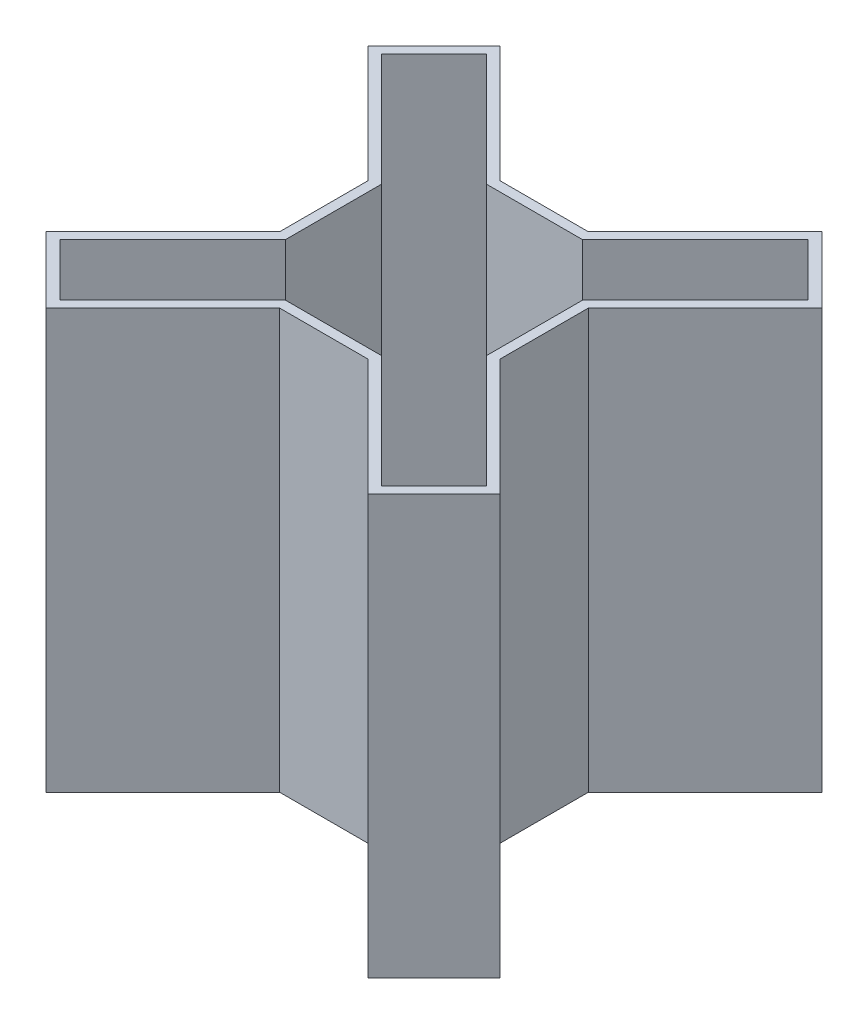
ISO-10303-21;
HEADER;
FILE_DESCRIPTION(('STEP AP214'),'2;1');
FILE_NAME('part.step','',(''),(''),'','','');
FILE_SCHEMA(('AUTOMOTIVE_DESIGN { 1 0 10303 214 1 1 1 1 }'));
ENDSEC;
DATA;
#1=APPLICATION_CONTEXT('core data for automotive mechanical design processes');
#2=APPLICATION_PROTOCOL_DEFINITION('international standard','automotive_design',2000,#1);
#3=PRODUCT_CONTEXT('',#1,'mechanical');
#4=PRODUCT('Part','Part','',(#3));
#5=PRODUCT_RELATED_PRODUCT_CATEGORY('part','',(#4));
#6=PRODUCT_DEFINITION_FORMATION('','',#4);
#7=PRODUCT_DEFINITION_CONTEXT('part definition',#1,'design');
#8=PRODUCT_DEFINITION('design','',#6,#7);
#9=PRODUCT_DEFINITION_SHAPE('','',#8);
#10=(LENGTH_UNIT() NAMED_UNIT(*) SI_UNIT(.MILLI.,.METRE.));
#11=(NAMED_UNIT(*) PLANE_ANGLE_UNIT() SI_UNIT($,.RADIAN.));
#12=(NAMED_UNIT(*) SI_UNIT($,.STERADIAN.) SOLID_ANGLE_UNIT());
#13=UNCERTAINTY_MEASURE_WITH_UNIT(LENGTH_MEASURE(1.E-05),#10,'distance_accuracy_value','');
#14=(GEOMETRIC_REPRESENTATION_CONTEXT(3) GLOBAL_UNCERTAINTY_ASSIGNED_CONTEXT((#13)) GLOBAL_UNIT_ASSIGNED_CONTEXT((#10,
#11,#12)) REPRESENTATION_CONTEXT('',''));
#15=CARTESIAN_POINT('',(0.,0.,0.));
#16=DIRECTION('',(0.,0.,1.));
#17=DIRECTION('',(1.,0.,0.));
#18=AXIS2_PLACEMENT_3D('',#15,#16,#17);
#19=CARTESIAN_POINT('',(-113.787540309447,-420.,44.4220917886808));
#20=DIRECTION('',(-1.,0.,0.));
#21=DIRECTION('',(0.,0.,1.));
#22=AXIS2_PLACEMENT_3D('',#19,#20,#21);
#23=PLANE('',#22);
#24=DIRECTION('',(0.,0.,1.));
#25=VECTOR('',#24,1.);
#26=CARTESIAN_POINT('',(-113.787540309447,0.,44.4220917886808));
#27=LINE('',#26,#25);
#28=CARTESIAN_POINT('',(-113.787540309447,0.,-45.9052893155388));
#29=VERTEX_POINT('',#28);
#30=CARTESIAN_POINT('',(-113.787540309447,0.,44.4220917886808));
#31=VERTEX_POINT('',#30);
#32=EDGE_CURVE('E462',#29,#31,#27,.T.);
#33=ORIENTED_EDGE('',*,*,#32,.F.);
#34=DIRECTION('',(0.,1.,0.));
#35=VECTOR('',#34,1.);
#36=CARTESIAN_POINT('',(-113.787540309447,-420.,-45.9052893155388));
#37=LINE('',#36,#35);
#38=CARTESIAN_POINT('',(-113.787540309447,-430.,-45.9052893155388));
#39=VERTEX_POINT('',#38);
#40=EDGE_CURVE('E11',#39,#29,#37,.T.);
#41=ORIENTED_EDGE('',*,*,#40,.F.);
#42=DIRECTION('',(0.,0.,-1.));
#43=VECTOR('',#42,1.);
#44=CARTESIAN_POINT('',(-113.787540309447,-430.,44.4220917886808));
#45=LINE('',#44,#43);
#46=CARTESIAN_POINT('',(-113.787540309447,-430.,44.4220917886808));
#47=VERTEX_POINT('',#46);
#48=EDGE_CURVE('E267',#47,#39,#45,.T.);
#49=ORIENTED_EDGE('',*,*,#48,.F.);
#50=DIRECTION('',(0.,1.,0.));
#51=VECTOR('',#50,1.);
#52=CARTESIAN_POINT('',(-113.787540309447,-420.,44.4220917886808));
#53=LINE('',#52,#51);
#54=EDGE_CURVE('E48',#47,#31,#53,.T.);
#55=ORIENTED_EDGE('',*,*,#54,.T.);
#56=EDGE_LOOP('',(#33,#41,#49,#55));
#57=FACE_BOUND('',#56,.T.);
#58=ADVANCED_FACE('F45',(#57),#23,.T.);
#59=CARTESIAN_POINT('',(-113.787540309447,-420.,-45.9052893155388));
#60=DIRECTION('',(-0.707106781186547,0.,0.707106781186548));
#61=DIRECTION('',(0.707106781186548,0.,0.707106781186547));
#62=AXIS2_PLACEMENT_3D('',#59,#60,#61);
#63=PLANE('',#62);
#64=DIRECTION('',(0.707106781186548,0.,0.707106781186547));
#65=VECTOR('',#64,1.);
#66=CARTESIAN_POINT('',(-113.787540309447,0.,-45.9052893155388));
#67=LINE('',#66,#65);
#68=CARTESIAN_POINT('',(-233.518909135593,0.,-165.636658141684));
#69=VERTEX_POINT('',#68);
#70=EDGE_CURVE('E265',#69,#29,#67,.T.);
#71=ORIENTED_EDGE('',*,*,#70,.F.);
#72=DIRECTION('',(0.,1.,0.));
#73=VECTOR('',#72,1.);
#74=CARTESIAN_POINT('',(-233.518909135593,-420.,-165.636658141684));
#75=LINE('',#74,#73);
#76=CARTESIAN_POINT('',(-233.518909135593,-430.,-165.636658141684));
#77=VERTEX_POINT('',#76);
#78=EDGE_CURVE('E54',#77,#69,#75,.T.);
#79=ORIENTED_EDGE('',*,*,#78,.F.);
#80=DIRECTION('',(-0.707106781186548,0.,-0.707106781186547));
#81=VECTOR('',#80,1.);
#82=CARTESIAN_POINT('',(-113.787540309447,-430.,-45.9052893155388));
#83=LINE('',#82,#81);
#84=EDGE_CURVE('E271',#39,#77,#83,.T.);
#85=ORIENTED_EDGE('',*,*,#84,.F.);
#86=ORIENTED_EDGE('',*,*,#40,.T.);
#87=EDGE_LOOP('',(#71,#79,#85,#86));
#88=FACE_BOUND('',#87,.T.);
#89=ADVANCED_FACE('F611',(#88),#63,.T.);
#90=CARTESIAN_POINT('',(-233.518909135593,-420.,-165.636658141684));
#91=DIRECTION('',(-0.707106781186548,0.,-0.707106781186548));
#92=DIRECTION('',(-0.707106781186548,0.,0.707106781186548));
#93=AXIS2_PLACEMENT_3D('',#90,#91,#92);
#94=PLANE('',#93);
#95=DIRECTION('',(-0.707106781186547,0.,0.707106781186547));
#96=VECTOR('',#95,1.);
#97=CARTESIAN_POINT('',(-233.518909135593,0.,-165.636658141684));
#98=LINE('',#97,#96);
#99=CARTESIAN_POINT('',(-165.636658141684,0.,-233.518909135593));
#100=VERTEX_POINT('',#99);
#101=EDGE_CURVE('E559',#100,#69,#98,.T.);
#102=ORIENTED_EDGE('',*,*,#101,.F.);
#103=DIRECTION('',(0.,1.,0.));
#104=VECTOR('',#103,1.);
#105=CARTESIAN_POINT('',(-165.636658141684,-420.,-233.518909135593));
#106=LINE('',#105,#104);
#107=CARTESIAN_POINT('',(-165.636658141684,-430.,-233.518909135593));
#108=VERTEX_POINT('',#107);
#109=EDGE_CURVE('E568',#108,#100,#106,.T.);
#110=ORIENTED_EDGE('',*,*,#109,.F.);
#111=DIRECTION('',(0.707106781186547,0.,-0.707106781186547));
#112=VECTOR('',#111,1.);
#113=CARTESIAN_POINT('',(-233.518909135593,-430.,-165.636658141684));
#114=LINE('',#113,#112);
#115=EDGE_CURVE('E283',#77,#108,#114,.T.);
#116=ORIENTED_EDGE('',*,*,#115,.F.);
#117=ORIENTED_EDGE('',*,*,#78,.T.);
#118=EDGE_LOOP('',(#102,#110,#116,#117));
#119=FACE_BOUND('',#118,.T.);
#120=ADVANCED_FACE('F615',(#119),#94,.T.);
#121=CARTESIAN_POINT('',(-45.9052893155389,-420.,-113.787540309447));
#122=DIRECTION('',(0.707106781186548,0.,-0.707106781186547));
#123=DIRECTION('',(-0.707106781186547,0.,-0.707106781186548));
#124=AXIS2_PLACEMENT_3D('',#121,#122,#123);
#125=PLANE('',#124);
#126=DIRECTION('',(-0.707106781186547,0.,-0.707106781186548));
#127=VECTOR('',#126,1.);
#128=CARTESIAN_POINT('',(-45.9052893155389,0.,-113.787540309447));
#129=LINE('',#128,#127);
#130=CARTESIAN_POINT('',(-45.9052893155389,0.,-113.787540309447));
#131=VERTEX_POINT('',#130);
#132=EDGE_CURVE('E555',#131,#100,#129,.T.);
#133=ORIENTED_EDGE('',*,*,#132,.F.);
#134=DIRECTION('',(0.,1.,0.));
#135=VECTOR('',#134,1.);
#136=CARTESIAN_POINT('',(-45.9052893155389,-420.,-113.787540309447));
#137=LINE('',#136,#135);
#138=CARTESIAN_POINT('',(-45.9052893155389,-430.,-113.787540309447));
#139=VERTEX_POINT('',#138);
#140=EDGE_CURVE('E571',#139,#131,#137,.T.);
#141=ORIENTED_EDGE('',*,*,#140,.F.);
#142=DIRECTION('',(0.707106781186547,0.,0.707106781186548));
#143=VECTOR('',#142,1.);
#144=CARTESIAN_POINT('',(-165.636658141684,-430.,-233.518909135593));
#145=LINE('',#144,#143);
#146=EDGE_CURVE('E287',#108,#139,#145,.T.);
#147=ORIENTED_EDGE('',*,*,#146,.F.);
#148=ORIENTED_EDGE('',*,*,#109,.T.);
#149=EDGE_LOOP('',(#133,#141,#147,#148));
#150=FACE_BOUND('',#149,.T.);
#151=ADVANCED_FACE('F618',(#150),#125,.T.);
#152=CARTESIAN_POINT('',(-45.9052893155389,-420.,-113.787540309447));
#153=DIRECTION('',(0.,0.,-1.));
#154=DIRECTION('',(-1.,0.,0.));
#155=AXIS2_PLACEMENT_3D('',#152,#153,#154);
#156=PLANE('',#155);
#157=DIRECTION('',(-1.,0.,0.));
#158=VECTOR('',#157,1.);
#159=CARTESIAN_POINT('',(-45.9052893155389,0.,-113.787540309447));
#160=LINE('',#159,#158);
#161=CARTESIAN_POINT('',(44.4220917886808,0.,-113.787540309447));
#162=VERTEX_POINT('',#161);
#163=EDGE_CURVE('E551',#162,#131,#160,.T.);
#164=ORIENTED_EDGE('',*,*,#163,.F.);
#165=DIRECTION('',(0.,1.,0.));
#166=VECTOR('',#165,1.);
#167=CARTESIAN_POINT('',(44.4220917886808,-420.,-113.787540309447));
#168=LINE('',#167,#166);
#169=CARTESIAN_POINT('',(44.4220917886808,-430.,-113.787540309447));
#170=VERTEX_POINT('',#169);
#171=EDGE_CURVE('E574',#170,#162,#168,.T.);
#172=ORIENTED_EDGE('',*,*,#171,.F.);
#173=DIRECTION('',(1.,0.,0.));
#174=VECTOR('',#173,1.);
#175=CARTESIAN_POINT('',(-45.9052893155389,-430.,-113.787540309447));
#176=LINE('',#175,#174);
#177=EDGE_CURVE('E291',#139,#170,#176,.T.);
#178=ORIENTED_EDGE('',*,*,#177,.F.);
#179=ORIENTED_EDGE('',*,*,#140,.T.);
#180=EDGE_LOOP('',(#164,#172,#178,#179));
#181=FACE_BOUND('',#180,.T.);
#182=ADVANCED_FACE('F623',(#181),#156,.T.);
#183=CARTESIAN_POINT('',(44.4220917886808,-420.,-113.787540309447));
#184=DIRECTION('',(-0.707106781186547,0.,-0.707106781186548));
#185=DIRECTION('',(-0.707106781186548,0.,0.707106781186547));
#186=AXIS2_PLACEMENT_3D('',#183,#184,#185);
#187=PLANE('',#186);
#188=DIRECTION('',(-0.707106781186548,0.,0.707106781186547));
#189=VECTOR('',#188,1.);
#190=CARTESIAN_POINT('',(44.4220917886808,0.,-113.787540309447));
#191=LINE('',#190,#189);
#192=CARTESIAN_POINT('',(164.153460614826,0.,-233.518909135592));
#193=VERTEX_POINT('',#192);
#194=EDGE_CURVE('E547',#193,#162,#191,.T.);
#195=ORIENTED_EDGE('',*,*,#194,.F.);
#196=DIRECTION('',(0.,1.,0.));
#197=VECTOR('',#196,1.);
#198=CARTESIAN_POINT('',(164.153460614826,-420.,-233.518909135592));
#199=LINE('',#198,#197);
#200=CARTESIAN_POINT('',(164.153460614826,-430.,-233.518909135592));
#201=VERTEX_POINT('',#200);
#202=EDGE_CURVE('E577',#201,#193,#199,.T.);
#203=ORIENTED_EDGE('',*,*,#202,.F.);
#204=DIRECTION('',(0.707106781186548,0.,-0.707106781186547));
#205=VECTOR('',#204,1.);
#206=CARTESIAN_POINT('',(44.4220917886808,-430.,-113.787540309447));
#207=LINE('',#206,#205);
#208=EDGE_CURVE('E295',#170,#201,#207,.T.);
#209=ORIENTED_EDGE('',*,*,#208,.F.);
#210=ORIENTED_EDGE('',*,*,#171,.T.);
#211=EDGE_LOOP('',(#195,#203,#209,#210));
#212=FACE_BOUND('',#211,.T.);
#213=ADVANCED_FACE('F626',(#212),#187,.T.);
#214=CARTESIAN_POINT('',(164.153460614826,-420.,-233.518909135592));
#215=DIRECTION('',(0.707106781186548,0.,-0.707106781186548));
#216=DIRECTION('',(-0.707106781186548,0.,-0.707106781186548));
#217=AXIS2_PLACEMENT_3D('',#214,#215,#216);
#218=PLANE('',#217);
#219=DIRECTION('',(-0.707106781186548,0.,-0.707106781186548));
#220=VECTOR('',#219,1.);
#221=CARTESIAN_POINT('',(164.153460614826,0.,-233.518909135592));
#222=LINE('',#221,#220);
#223=CARTESIAN_POINT('',(232.035711608734,0.,-165.636658141684));
#224=VERTEX_POINT('',#223);
#225=EDGE_CURVE('E543',#224,#193,#222,.T.);
#226=ORIENTED_EDGE('',*,*,#225,.F.);
#227=DIRECTION('',(0.,1.,0.));
#228=VECTOR('',#227,1.);
#229=CARTESIAN_POINT('',(232.035711608734,-420.,-165.636658141684));
#230=LINE('',#229,#228);
#231=CARTESIAN_POINT('',(232.035711608734,-430.,-165.636658141684));
#232=VERTEX_POINT('',#231);
#233=EDGE_CURVE('E580',#232,#224,#230,.T.);
#234=ORIENTED_EDGE('',*,*,#233,.F.);
#235=DIRECTION('',(0.707106781186548,0.,0.707106781186548));
#236=VECTOR('',#235,1.);
#237=CARTESIAN_POINT('',(164.153460614826,-430.,-233.518909135592));
#238=LINE('',#237,#236);
#239=EDGE_CURVE('E299',#201,#232,#238,.T.);
#240=ORIENTED_EDGE('',*,*,#239,.F.);
#241=ORIENTED_EDGE('',*,*,#202,.T.);
#242=EDGE_LOOP('',(#226,#234,#240,#241));
#243=FACE_BOUND('',#242,.T.);
#244=ADVANCED_FACE('F631',(#243),#218,.T.);
#245=CARTESIAN_POINT('',(112.304342782589,-420.,-45.9052893155389));
#246=DIRECTION('',(0.707106781186548,0.,0.707106781186548));
#247=DIRECTION('',(0.707106781186548,0.,-0.707106781186548));
#248=AXIS2_PLACEMENT_3D('',#245,#246,#247);
#249=PLANE('',#248);
#250=DIRECTION('',(0.707106781186548,0.,-0.707106781186548));
#251=VECTOR('',#250,1.);
#252=CARTESIAN_POINT('',(112.304342782589,0.,-45.9052893155389));
#253=LINE('',#252,#251);
#254=CARTESIAN_POINT('',(112.304342782589,0.,-45.9052893155389));
#255=VERTEX_POINT('',#254);
#256=EDGE_CURVE('E539',#255,#224,#253,.T.);
#257=ORIENTED_EDGE('',*,*,#256,.F.);
#258=DIRECTION('',(0.,1.,0.));
#259=VECTOR('',#258,1.);
#260=CARTESIAN_POINT('',(112.304342782589,-420.,-45.9052893155389));
#261=LINE('',#260,#259);
#262=CARTESIAN_POINT('',(112.304342782589,-430.,-45.9052893155389));
#263=VERTEX_POINT('',#262);
#264=EDGE_CURVE('E583',#263,#255,#261,.T.);
#265=ORIENTED_EDGE('',*,*,#264,.F.);
#266=DIRECTION('',(-0.707106781186548,0.,0.707106781186548));
#267=VECTOR('',#266,1.);
#268=CARTESIAN_POINT('',(232.035711608734,-430.,-165.636658141684));
#269=LINE('',#268,#267);
#270=EDGE_CURVE('E303',#232,#263,#269,.T.);
#271=ORIENTED_EDGE('',*,*,#270,.F.);
#272=ORIENTED_EDGE('',*,*,#233,.T.);
#273=EDGE_LOOP('',(#257,#265,#271,#272));
#274=FACE_BOUND('',#273,.T.);
#275=ADVANCED_FACE('F634',(#274),#249,.T.);
#276=CARTESIAN_POINT('',(112.304342782589,-420.,44.4220917886809));
#277=DIRECTION('',(1.,0.,0.));
#278=DIRECTION('',(0.,0.,-1.));
#279=AXIS2_PLACEMENT_3D('',#276,#277,#278);
#280=PLANE('',#279);
#281=DIRECTION('',(0.,0.,-1.));
#282=VECTOR('',#281,1.);
#283=CARTESIAN_POINT('',(112.304342782589,0.,44.4220917886809));
#284=LINE('',#283,#282);
#285=CARTESIAN_POINT('',(112.304342782589,0.,44.4220917886809));
#286=VERTEX_POINT('',#285);
#287=EDGE_CURVE('E535',#286,#255,#284,.T.);
#288=ORIENTED_EDGE('',*,*,#287,.F.);
#289=DIRECTION('',(0.,1.,0.));
#290=VECTOR('',#289,1.);
#291=CARTESIAN_POINT('',(112.304342782589,-420.,44.4220917886809));
#292=LINE('',#291,#290);
#293=CARTESIAN_POINT('',(112.304342782589,-430.,44.4220917886809));
#294=VERTEX_POINT('',#293);
#295=EDGE_CURVE('E586',#294,#286,#292,.T.);
#296=ORIENTED_EDGE('',*,*,#295,.F.);
#297=DIRECTION('',(0.,0.,1.));
#298=VECTOR('',#297,1.);
#299=CARTESIAN_POINT('',(112.304342782589,-430.,-45.9052893155389));
#300=LINE('',#299,#298);
#301=EDGE_CURVE('E307',#263,#294,#300,.T.);
#302=ORIENTED_EDGE('',*,*,#301,.F.);
#303=ORIENTED_EDGE('',*,*,#264,.T.);
#304=EDGE_LOOP('',(#288,#296,#302,#303));
#305=FACE_BOUND('',#304,.T.);
#306=ADVANCED_FACE('F639',(#305),#280,.T.);
#307=CARTESIAN_POINT('',(112.304342782589,-420.,44.4220917886809));
#308=DIRECTION('',(0.707106781186548,0.,-0.707106781186547));
#309=DIRECTION('',(-0.707106781186547,0.,-0.707106781186548));
#310=AXIS2_PLACEMENT_3D('',#307,#308,#309);
#311=PLANE('',#310);
#312=DIRECTION('',(-0.707106781186547,0.,-0.707106781186548));
#313=VECTOR('',#312,1.);
#314=CARTESIAN_POINT('',(112.304342782589,0.,44.4220917886809));
#315=LINE('',#314,#313);
#316=CARTESIAN_POINT('',(232.035711608735,0.,164.153460614826));
#317=VERTEX_POINT('',#316);
#318=EDGE_CURVE('E531',#317,#286,#315,.T.);
#319=ORIENTED_EDGE('',*,*,#318,.F.);
#320=DIRECTION('',(0.,1.,0.));
#321=VECTOR('',#320,1.);
#322=CARTESIAN_POINT('',(232.035711608735,-420.,164.153460614826));
#323=LINE('',#322,#321);
#324=CARTESIAN_POINT('',(232.035711608735,-430.,164.153460614826));
#325=VERTEX_POINT('',#324);
#326=EDGE_CURVE('E589',#325,#317,#323,.T.);
#327=ORIENTED_EDGE('',*,*,#326,.F.);
#328=DIRECTION('',(0.707106781186547,0.,0.707106781186548));
#329=VECTOR('',#328,1.);
#330=CARTESIAN_POINT('',(112.304342782589,-430.,44.4220917886809));
#331=LINE('',#330,#329);
#332=EDGE_CURVE('E311',#294,#325,#331,.T.);
#333=ORIENTED_EDGE('',*,*,#332,.F.);
#334=ORIENTED_EDGE('',*,*,#295,.T.);
#335=EDGE_LOOP('',(#319,#327,#333,#334));
#336=FACE_BOUND('',#335,.T.);
#337=ADVANCED_FACE('F642',(#336),#311,.T.);
#338=CARTESIAN_POINT('',(232.035711608735,-420.,164.153460614826));
#339=DIRECTION('',(0.707106781186548,0.,0.707106781186548));
#340=DIRECTION('',(0.707106781186548,0.,-0.707106781186548));
#341=AXIS2_PLACEMENT_3D('',#338,#339,#340);
#342=PLANE('',#341);
#343=DIRECTION('',(0.707106781186548,0.,-0.707106781186548));
#344=VECTOR('',#343,1.);
#345=CARTESIAN_POINT('',(232.035711608735,0.,164.153460614826));
#346=LINE('',#345,#344);
#347=CARTESIAN_POINT('',(164.153460614826,0.,232.035711608735));
#348=VERTEX_POINT('',#347);
#349=EDGE_CURVE('E527',#348,#317,#346,.T.);
#350=ORIENTED_EDGE('',*,*,#349,.F.);
#351=DIRECTION('',(0.,1.,0.));
#352=VECTOR('',#351,1.);
#353=CARTESIAN_POINT('',(164.153460614826,-420.,232.035711608735));
#354=LINE('',#353,#352);
#355=CARTESIAN_POINT('',(164.153460614826,-430.,232.035711608735));
#356=VERTEX_POINT('',#355);
#357=EDGE_CURVE('E592',#356,#348,#354,.T.);
#358=ORIENTED_EDGE('',*,*,#357,.F.);
#359=DIRECTION('',(-0.707106781186548,0.,0.707106781186548));
#360=VECTOR('',#359,1.);
#361=CARTESIAN_POINT('',(232.035711608735,-430.,164.153460614826));
#362=LINE('',#361,#360);
#363=EDGE_CURVE('E315',#325,#356,#362,.T.);
#364=ORIENTED_EDGE('',*,*,#363,.F.);
#365=ORIENTED_EDGE('',*,*,#326,.T.);
#366=EDGE_LOOP('',(#350,#358,#364,#365));
#367=FACE_BOUND('',#366,.T.);
#368=ADVANCED_FACE('F647',(#367),#342,.T.);
#369=CARTESIAN_POINT('',(44.4220917886807,-420.,112.304342782589));
#370=DIRECTION('',(-0.707106781186547,0.,0.707106781186548));
#371=DIRECTION('',(0.707106781186548,0.,0.707106781186547));
#372=AXIS2_PLACEMENT_3D('',#369,#370,#371);
#373=PLANE('',#372);
#374=DIRECTION('',(0.707106781186548,0.,0.707106781186547));
#375=VECTOR('',#374,1.);
#376=CARTESIAN_POINT('',(44.4220917886807,0.,112.304342782589));
#377=LINE('',#376,#375);
#378=CARTESIAN_POINT('',(44.4220917886807,0.,112.304342782589));
#379=VERTEX_POINT('',#378);
#380=EDGE_CURVE('E523',#379,#348,#377,.T.);
#381=ORIENTED_EDGE('',*,*,#380,.F.);
#382=DIRECTION('',(0.,1.,0.));
#383=VECTOR('',#382,1.);
#384=CARTESIAN_POINT('',(44.4220917886807,-420.,112.304342782589));
#385=LINE('',#384,#383);
#386=CARTESIAN_POINT('',(44.4220917886807,-430.,112.304342782589));
#387=VERTEX_POINT('',#386);
#388=EDGE_CURVE('E595',#387,#379,#385,.T.);
#389=ORIENTED_EDGE('',*,*,#388,.F.);
#390=DIRECTION('',(-0.707106781186548,0.,-0.707106781186547));
#391=VECTOR('',#390,1.);
#392=CARTESIAN_POINT('',(164.153460614826,-430.,232.035711608735));
#393=LINE('',#392,#391);
#394=EDGE_CURVE('E319',#356,#387,#393,.T.);
#395=ORIENTED_EDGE('',*,*,#394,.F.);
#396=ORIENTED_EDGE('',*,*,#357,.T.);
#397=EDGE_LOOP('',(#381,#389,#395,#396));
#398=FACE_BOUND('',#397,.T.);
#399=ADVANCED_FACE('F650',(#398),#373,.T.);
#400=CARTESIAN_POINT('',(-45.9052893155387,-420.,112.304342782589));
#401=DIRECTION('',(0.,0.,1.));
#402=DIRECTION('',(1.,0.,0.));
#403=AXIS2_PLACEMENT_3D('',#400,#401,#402);
#404=PLANE('',#403);
#405=DIRECTION('',(1.,0.,0.));
#406=VECTOR('',#405,1.);
#407=CARTESIAN_POINT('',(-45.9052893155387,0.,112.304342782589));
#408=LINE('',#407,#406);
#409=CARTESIAN_POINT('',(-45.9052893155387,0.,112.304342782589));
#410=VERTEX_POINT('',#409);
#411=EDGE_CURVE('E519',#410,#379,#408,.T.);
#412=ORIENTED_EDGE('',*,*,#411,.F.);
#413=DIRECTION('',(0.,1.,0.));
#414=VECTOR('',#413,1.);
#415=CARTESIAN_POINT('',(-45.9052893155387,-420.,112.304342782589));
#416=LINE('',#415,#414);
#417=CARTESIAN_POINT('',(-45.9052893155387,-430.,112.304342782589));
#418=VERTEX_POINT('',#417);
#419=EDGE_CURVE('E598',#418,#410,#416,.T.);
#420=ORIENTED_EDGE('',*,*,#419,.F.);
#421=DIRECTION('',(-1.,0.,0.));
#422=VECTOR('',#421,1.);
#423=CARTESIAN_POINT('',(44.4220917886807,-430.,112.304342782589));
#424=LINE('',#423,#422);
#425=EDGE_CURVE('E323',#387,#418,#424,.T.);
#426=ORIENTED_EDGE('',*,*,#425,.F.);
#427=ORIENTED_EDGE('',*,*,#388,.T.);
#428=EDGE_LOOP('',(#412,#420,#426,#427));
#429=FACE_BOUND('',#428,.T.);
#430=ADVANCED_FACE('F655',(#429),#404,.T.);
#431=CARTESIAN_POINT('',(-45.9052893155387,-420.,112.304342782589));
#432=DIRECTION('',(0.707106781186548,0.,0.707106781186547));
#433=DIRECTION('',(0.707106781186547,0.,-0.707106781186548));
#434=AXIS2_PLACEMENT_3D('',#431,#432,#433);
#435=PLANE('',#434);
#436=DIRECTION('',(0.707106781186547,0.,-0.707106781186548));
#437=VECTOR('',#436,1.);
#438=CARTESIAN_POINT('',(-45.9052893155387,0.,112.304342782589));
#439=LINE('',#438,#437);
#440=CARTESIAN_POINT('',(-165.636658141684,0.,232.035711608735));
#441=VERTEX_POINT('',#440);
#442=EDGE_CURVE('E515',#441,#410,#439,.T.);
#443=ORIENTED_EDGE('',*,*,#442,.F.);
#444=DIRECTION('',(0.,1.,0.));
#445=VECTOR('',#444,1.);
#446=CARTESIAN_POINT('',(-165.636658141684,-420.,232.035711608735));
#447=LINE('',#446,#445);
#448=CARTESIAN_POINT('',(-165.636658141684,-430.,232.035711608735));
#449=VERTEX_POINT('',#448);
#450=EDGE_CURVE('E601',#449,#441,#447,.T.);
#451=ORIENTED_EDGE('',*,*,#450,.F.);
#452=DIRECTION('',(-0.707106781186547,0.,0.707106781186548));
#453=VECTOR('',#452,1.);
#454=CARTESIAN_POINT('',(-45.9052893155387,-430.,112.304342782589));
#455=LINE('',#454,#453);
#456=EDGE_CURVE('E327',#418,#449,#455,.T.);
#457=ORIENTED_EDGE('',*,*,#456,.F.);
#458=ORIENTED_EDGE('',*,*,#419,.T.);
#459=EDGE_LOOP('',(#443,#451,#457,#458));
#460=FACE_BOUND('',#459,.T.);
#461=ADVANCED_FACE('F657',(#460),#435,.T.);
#462=CARTESIAN_POINT('',(-165.636658141684,-420.,232.035711608735));
#463=DIRECTION('',(-0.707106781186548,0.,0.707106781186547));
#464=DIRECTION('',(0.707106781186547,0.,0.707106781186548));
#465=AXIS2_PLACEMENT_3D('',#462,#463,#464);
#466=PLANE('',#465);
#467=DIRECTION('',(0.707106781186547,0.,0.707106781186548));
#468=VECTOR('',#467,1.);
#469=CARTESIAN_POINT('',(-165.636658141684,0.,232.035711608735));
#470=LINE('',#469,#468);
#471=CARTESIAN_POINT('',(-233.518909135593,0.,164.153460614826));
#472=VERTEX_POINT('',#471);
#473=EDGE_CURVE('E511',#472,#441,#470,.T.);
#474=ORIENTED_EDGE('',*,*,#473,.F.);
#475=DIRECTION('',(0.,1.,0.));
#476=VECTOR('',#475,1.);
#477=CARTESIAN_POINT('',(-233.518909135593,-420.,164.153460614826));
#478=LINE('',#477,#476);
#479=CARTESIAN_POINT('',(-233.518909135593,-430.,164.153460614826));
#480=VERTEX_POINT('',#479);
#481=EDGE_CURVE('E264',#480,#472,#478,.T.);
#482=ORIENTED_EDGE('',*,*,#481,.F.);
#483=DIRECTION('',(-0.707106781186547,0.,-0.707106781186548));
#484=VECTOR('',#483,1.);
#485=CARTESIAN_POINT('',(-165.636658141684,-430.,232.035711608735));
#486=LINE('',#485,#484);
#487=EDGE_CURVE('E277',#449,#480,#486,.T.);
#488=ORIENTED_EDGE('',*,*,#487,.F.);
#489=ORIENTED_EDGE('',*,*,#450,.T.);
#490=EDGE_LOOP('',(#474,#482,#488,#489));
#491=FACE_BOUND('',#490,.T.);
#492=ADVANCED_FACE('F606',(#491),#466,.T.);
#493=CARTESIAN_POINT('',(-113.787540309447,-420.,44.4220917886808));
#494=DIRECTION('',(-0.707106781186548,0.,-0.707106781186547));
#495=DIRECTION('',(-0.707106781186547,0.,0.707106781186548));
#496=AXIS2_PLACEMENT_3D('',#493,#494,#495);
#497=PLANE('',#496);
#498=DIRECTION('',(-0.707106781186547,0.,0.707106781186548));
#499=VECTOR('',#498,1.);
#500=CARTESIAN_POINT('',(-113.787540309447,0.,44.4220917886808));
#501=LINE('',#500,#499);
#502=EDGE_CURVE('E260',#31,#472,#501,.T.);
#503=ORIENTED_EDGE('',*,*,#502,.F.);
#504=ORIENTED_EDGE('',*,*,#54,.F.);
#505=DIRECTION('',(0.707106781186547,0.,-0.707106781186548));
#506=VECTOR('',#505,1.);
#507=CARTESIAN_POINT('',(-233.518909135593,-430.,164.153460614826));
#508=LINE('',#507,#506);
#509=EDGE_CURVE('E258',#480,#47,#508,.T.);
#510=ORIENTED_EDGE('',*,*,#509,.F.);
#511=ORIENTED_EDGE('',*,*,#481,.T.);
#512=EDGE_LOOP('',(#503,#504,#510,#511));
#513=FACE_BOUND('',#512,.T.);
#514=ADVANCED_FACE('F256',(#513),#497,.T.);
#515=CARTESIAN_POINT('',(0.,0.,0.));
#516=DIRECTION('',(0.,-1.,0.));
#517=DIRECTION('',(0.,0.,-1.));
#518=AXIS2_PLACEMENT_3D('',#515,#516,#517);
#519=PLANE('',#518);
#520=DIRECTION('',(-1.,0.,0.));
#521=VECTOR('',#520,1.);
#522=CARTESIAN_POINT('',(-50.0474249392698,0.,-103.787540309447));
#523=LINE('',#522,#521);
#524=CARTESIAN_POINT('',(48.5642274124118,0.,-103.787540309447));
#525=VERTEX_POINT('',#524);
#526=CARTESIAN_POINT('',(-50.0474249392698,0.,-103.787540309447));
#527=VERTEX_POINT('',#526);
#528=EDGE_CURVE('E400',#525,#527,#523,.T.);
#529=ORIENTED_EDGE('',*,*,#528,.F.);
#530=DIRECTION('',(-0.707106781186548,0.,0.707106781186547));
#531=VECTOR('',#530,1.);
#532=CARTESIAN_POINT('',(48.5642274124118,0.,-103.787540309447));
#533=LINE('',#532,#531);
#534=CARTESIAN_POINT('',(164.153460614826,0.,-219.376773511862));
#535=VERTEX_POINT('',#534);
#536=EDGE_CURVE('E62',#535,#525,#533,.T.);
#537=ORIENTED_EDGE('',*,*,#536,.F.);
#538=DIRECTION('',(-0.707106781186555,0.,-0.707106781186539));
#539=VECTOR('',#538,1.);
#540=CARTESIAN_POINT('',(164.153460614826,0.,-219.376773511862));
#541=LINE('',#540,#539);
#542=CARTESIAN_POINT('',(217.893575985004,0.,-165.636658141685));
#543=VERTEX_POINT('',#542);
#544=EDGE_CURVE('E337',#543,#535,#541,.T.);
#545=ORIENTED_EDGE('',*,*,#544,.F.);
#546=DIRECTION('',(0.707106781186548,0.,-0.707106781186548));
#547=VECTOR('',#546,1.);
#548=CARTESIAN_POINT('',(102.304342782589,0.,-50.0474249392698));
#549=LINE('',#548,#547);
#550=CARTESIAN_POINT('',(102.304342782589,0.,-50.0474249392698));
#551=VERTEX_POINT('',#550);
#552=EDGE_CURVE('E452',#551,#543,#549,.T.);
#553=ORIENTED_EDGE('',*,*,#552,.F.);
#554=DIRECTION('',(0.,0.,-1.));
#555=VECTOR('',#554,1.);
#556=CARTESIAN_POINT('',(102.304342782589,0.,48.5642274124118));
#557=LINE('',#556,#555);
#558=CARTESIAN_POINT('',(102.304342782589,0.,48.5642274124118));
#559=VERTEX_POINT('',#558);
#560=EDGE_CURVE('E448',#559,#551,#557,.T.);
#561=ORIENTED_EDGE('',*,*,#560,.F.);
#562=DIRECTION('',(-0.707106781186543,0.,-0.707106781186551));
#563=VECTOR('',#562,1.);
#564=CARTESIAN_POINT('',(102.304342782589,0.,48.5642274124118));
#565=LINE('',#564,#563);
#566=CARTESIAN_POINT('',(217.893575985003,0.,164.153460614827));
#567=VERTEX_POINT('',#566);
#568=EDGE_CURVE('E444',#567,#559,#565,.T.);
#569=ORIENTED_EDGE('',*,*,#568,.F.);
#570=DIRECTION('',(0.707106781186542,0.,-0.707106781186553));
#571=VECTOR('',#570,1.);
#572=CARTESIAN_POINT('',(217.893575985003,0.,164.153460614827));
#573=LINE('',#572,#571);
#574=CARTESIAN_POINT('',(164.153460614826,0.,217.893575985005));
#575=VERTEX_POINT('',#574);
#576=EDGE_CURVE('E440',#575,#567,#573,.T.);
#577=ORIENTED_EDGE('',*,*,#576,.F.);
#578=DIRECTION('',(0.707106781186544,0.,0.707106781186551));
#579=VECTOR('',#578,1.);
#580=CARTESIAN_POINT('',(48.5642274124117,0.,102.304342782589));
#581=LINE('',#580,#579);
#582=CARTESIAN_POINT('',(48.5642274124117,0.,102.304342782589));
#583=VERTEX_POINT('',#582);
#584=EDGE_CURVE('E436',#583,#575,#581,.T.);
#585=ORIENTED_EDGE('',*,*,#584,.F.);
#586=DIRECTION('',(1.,0.,0.));
#587=VECTOR('',#586,1.);
#588=CARTESIAN_POINT('',(-50.0474249392697,0.,102.304342782589));
#589=LINE('',#588,#587);
#590=CARTESIAN_POINT('',(-50.0474249392697,0.,102.304342782589));
#591=VERTEX_POINT('',#590);
#592=EDGE_CURVE('E432',#591,#583,#589,.T.);
#593=ORIENTED_EDGE('',*,*,#592,.F.);
#594=DIRECTION('',(0.707106781186556,0.,-0.707106781186539));
#595=VECTOR('',#594,1.);
#596=CARTESIAN_POINT('',(-50.0474249392697,0.,102.304342782589));
#597=LINE('',#596,#595);
#598=CARTESIAN_POINT('',(-165.636658141685,0.,217.893575985002));
#599=VERTEX_POINT('',#598);
#600=EDGE_CURVE('E428',#599,#591,#597,.T.);
#601=ORIENTED_EDGE('',*,*,#600,.F.);
#602=DIRECTION('',(0.70710678118655,0.,0.707106781186545));
#603=VECTOR('',#602,1.);
#604=CARTESIAN_POINT('',(-165.636658141685,0.,217.893575985002));
#605=LINE('',#604,#603);
#606=CARTESIAN_POINT('',(-219.376773511863,0.,164.153460614825));
#607=VERTEX_POINT('',#606);
#608=EDGE_CURVE('E424',#607,#599,#605,.T.);
#609=ORIENTED_EDGE('',*,*,#608,.F.);
#610=DIRECTION('',(-0.707106781186556,0.,0.707106781186539));
#611=VECTOR('',#610,1.);
#612=CARTESIAN_POINT('',(-103.787540309447,0.,48.5642274124117));
#613=LINE('',#612,#611);
#614=CARTESIAN_POINT('',(-103.787540309447,0.,48.5642274124117));
#615=VERTEX_POINT('',#614);
#616=EDGE_CURVE('E420',#615,#607,#613,.T.);
#617=ORIENTED_EDGE('',*,*,#616,.F.);
#618=DIRECTION('',(0.,0.,1.));
#619=VECTOR('',#618,1.);
#620=CARTESIAN_POINT('',(-103.787540309447,0.,48.5642274124117));
#621=LINE('',#620,#619);
#622=CARTESIAN_POINT('',(-103.787540309447,0.,-50.0474249392697));
#623=VERTEX_POINT('',#622);
#624=EDGE_CURVE('E416',#623,#615,#621,.T.);
#625=ORIENTED_EDGE('',*,*,#624,.F.);
#626=DIRECTION('',(0.707106781186535,0.,0.70710678118656));
#627=VECTOR('',#626,1.);
#628=CARTESIAN_POINT('',(-103.787540309447,0.,-50.0474249392697));
#629=LINE('',#628,#627);
#630=CARTESIAN_POINT('',(-219.37677351186,0.,-165.636658141686));
#631=VERTEX_POINT('',#630);
#632=EDGE_CURVE('E412',#631,#623,#629,.T.);
#633=ORIENTED_EDGE('',*,*,#632,.F.);
#634=DIRECTION('',(-0.707106781186547,0.,0.707106781186548));
#635=VECTOR('',#634,1.);
#636=CARTESIAN_POINT('',(-219.37677351186,0.,-165.636658141686));
#637=LINE('',#636,#635);
#638=CARTESIAN_POINT('',(-165.636658141682,0.,-219.376773511864));
#639=VERTEX_POINT('',#638);
#640=EDGE_CURVE('E408',#639,#631,#637,.T.);
#641=ORIENTED_EDGE('',*,*,#640,.F.);
#642=DIRECTION('',(-0.707106781186535,0.,-0.70710678118656));
#643=VECTOR('',#642,1.);
#644=CARTESIAN_POINT('',(-50.0474249392698,0.,-103.787540309447));
#645=LINE('',#644,#643);
#646=EDGE_CURVE('E404',#527,#639,#645,.T.);
#647=ORIENTED_EDGE('',*,*,#646,.F.);
#648=EDGE_LOOP('',(#529,#537,#545,#553,#561,#569,#577,#585,#593,#601,#609,#617,#625,#633,#641,#647));
#649=FACE_BOUND('',#648,.T.);
#650=ORIENTED_EDGE('',*,*,#32,.T.);
#651=ORIENTED_EDGE('',*,*,#502,.T.);
#652=ORIENTED_EDGE('',*,*,#473,.T.);
#653=ORIENTED_EDGE('',*,*,#442,.T.);
#654=ORIENTED_EDGE('',*,*,#411,.T.);
#655=ORIENTED_EDGE('',*,*,#380,.T.);
#656=ORIENTED_EDGE('',*,*,#349,.T.);
#657=ORIENTED_EDGE('',*,*,#318,.T.);
#658=ORIENTED_EDGE('',*,*,#287,.T.);
#659=ORIENTED_EDGE('',*,*,#256,.T.);
#660=ORIENTED_EDGE('',*,*,#225,.T.);
#661=ORIENTED_EDGE('',*,*,#194,.T.);
#662=ORIENTED_EDGE('',*,*,#163,.T.);
#663=ORIENTED_EDGE('',*,*,#132,.T.);
#664=ORIENTED_EDGE('',*,*,#101,.T.);
#665=ORIENTED_EDGE('',*,*,#70,.T.);
#666=EDGE_LOOP('',(#650,#651,#652,#653,#654,#655,#656,#657,#658,#659,#660,#661,#662,#663,#664,#665));
#667=FACE_BOUND('',#666,.T.);
#668=ADVANCED_FACE('F609',(#649,#667),#519,.F.);
#669=CARTESIAN_POINT('',(48.5642274124118,-420.,-103.787540309447));
#670=DIRECTION('',(-0.707106781186547,0.,-0.707106781186548));
#671=DIRECTION('',(-0.707106781186548,0.,0.707106781186547));
#672=AXIS2_PLACEMENT_3D('',#669,#670,#671);
#673=PLANE('',#672);
#674=ORIENTED_EDGE('',*,*,#536,.T.);
#675=DIRECTION('',(0.,1.,0.));
#676=VECTOR('',#675,1.);
#677=CARTESIAN_POINT('',(48.5642274124118,-420.,-103.787540309447));
#678=LINE('',#677,#676);
#679=CARTESIAN_POINT('',(48.5642274124118,-420.,-103.787540309447));
#680=VERTEX_POINT('',#679);
#681=EDGE_CURVE('E397',#680,#525,#678,.T.);
#682=ORIENTED_EDGE('',*,*,#681,.F.);
#683=DIRECTION('',(-0.707106781186548,0.,0.707106781186547));
#684=VECTOR('',#683,1.);
#685=CARTESIAN_POINT('',(48.5642274124118,-420.,-103.787540309447));
#686=LINE('',#685,#684);
#687=CARTESIAN_POINT('',(164.153460614826,-420.,-219.376773511862));
#688=VERTEX_POINT('',#687);
#689=EDGE_CURVE('E332',#688,#680,#686,.T.);
#690=ORIENTED_EDGE('',*,*,#689,.F.);
#691=DIRECTION('',(0.,1.,0.));
#692=VECTOR('',#691,1.);
#693=CARTESIAN_POINT('',(164.153460614826,-420.,-219.376773511862));
#694=LINE('',#693,#692);
#695=EDGE_CURVE('E459',#688,#535,#694,.T.);
#696=ORIENTED_EDGE('',*,*,#695,.T.);
#697=EDGE_LOOP('',(#674,#682,#690,#696));
#698=FACE_BOUND('',#697,.T.);
#699=ADVANCED_FACE('F762',(#698),#673,.F.);
#700=CARTESIAN_POINT('',(164.153460614826,-420.,-219.376773511862));
#701=DIRECTION('',(0.707106781186539,0.,-0.707106781186555));
#702=DIRECTION('',(-0.707106781186556,0.,-0.70710678118654));
#703=AXIS2_PLACEMENT_3D('',#700,#701,#702);
#704=PLANE('',#703);
#705=ORIENTED_EDGE('',*,*,#544,.T.);
#706=ORIENTED_EDGE('',*,*,#695,.F.);
#707=DIRECTION('',(-0.707106781186555,0.,-0.707106781186539));
#708=VECTOR('',#707,1.);
#709=CARTESIAN_POINT('',(164.153460614826,-420.,-219.376773511862));
#710=LINE('',#709,#708);
#711=CARTESIAN_POINT('',(217.893575985004,-420.,-165.636658141685));
#712=VERTEX_POINT('',#711);
#713=EDGE_CURVE('E393',#712,#688,#710,.T.);
#714=ORIENTED_EDGE('',*,*,#713,.F.);
#715=DIRECTION('',(0.,1.,0.));
#716=VECTOR('',#715,1.);
#717=CARTESIAN_POINT('',(217.893575985004,-420.,-165.636658141685));
#718=LINE('',#717,#716);
#719=EDGE_CURVE('E463',#712,#543,#718,.T.);
#720=ORIENTED_EDGE('',*,*,#719,.T.);
#721=EDGE_LOOP('',(#705,#706,#714,#720));
#722=FACE_BOUND('',#721,.T.);
#723=ADVANCED_FACE('F758',(#722),#704,.F.);
#724=CARTESIAN_POINT('',(102.304342782589,-420.,-50.0474249392698));
#725=DIRECTION('',(0.707106781186548,0.,0.707106781186548));
#726=DIRECTION('',(0.707106781186547,0.,-0.707106781186548));
#727=AXIS2_PLACEMENT_3D('',#724,#725,#726);
#728=PLANE('',#727);
#729=ORIENTED_EDGE('',*,*,#552,.T.);
#730=ORIENTED_EDGE('',*,*,#719,.F.);
#731=DIRECTION('',(0.707106781186548,0.,-0.707106781186548));
#732=VECTOR('',#731,1.);
#733=CARTESIAN_POINT('',(102.304342782589,-420.,-50.0474249392698));
#734=LINE('',#733,#732);
#735=CARTESIAN_POINT('',(102.304342782589,-420.,-50.0474249392698));
#736=VERTEX_POINT('',#735);
#737=EDGE_CURVE('E389',#736,#712,#734,.T.);
#738=ORIENTED_EDGE('',*,*,#737,.F.);
#739=DIRECTION('',(0.,1.,0.));
#740=VECTOR('',#739,1.);
#741=CARTESIAN_POINT('',(102.304342782589,-420.,-50.0474249392698));
#742=LINE('',#741,#740);
#743=EDGE_CURVE('E466',#736,#551,#742,.T.);
#744=ORIENTED_EDGE('',*,*,#743,.T.);
#745=EDGE_LOOP('',(#729,#730,#738,#744));
#746=FACE_BOUND('',#745,.T.);
#747=ADVANCED_FACE('F761',(#746),#728,.F.);
#748=CARTESIAN_POINT('',(102.304342782589,-420.,48.5642274124118));
#749=DIRECTION('',(1.,0.,0.));
#750=DIRECTION('',(0.,0.,-1.));
#751=AXIS2_PLACEMENT_3D('',#748,#749,#750);
#752=PLANE('',#751);
#753=ORIENTED_EDGE('',*,*,#560,.T.);
#754=ORIENTED_EDGE('',*,*,#743,.F.);
#755=DIRECTION('',(0.,0.,-1.));
#756=VECTOR('',#755,1.);
#757=CARTESIAN_POINT('',(102.304342782589,-420.,48.5642274124118));
#758=LINE('',#757,#756);
#759=CARTESIAN_POINT('',(102.304342782589,-420.,48.5642274124118));
#760=VERTEX_POINT('',#759);
#761=EDGE_CURVE('E385',#760,#736,#758,.T.);
#762=ORIENTED_EDGE('',*,*,#761,.F.);
#763=DIRECTION('',(0.,1.,0.));
#764=VECTOR('',#763,1.);
#765=CARTESIAN_POINT('',(102.304342782589,-420.,48.5642274124118));
#766=LINE('',#765,#764);
#767=EDGE_CURVE('E469',#760,#559,#766,.T.);
#768=ORIENTED_EDGE('',*,*,#767,.T.);
#769=EDGE_LOOP('',(#753,#754,#762,#768));
#770=FACE_BOUND('',#769,.T.);
#771=ADVANCED_FACE('F766',(#770),#752,.F.);
#772=CARTESIAN_POINT('',(102.304342782589,-420.,48.5642274124118));
#773=DIRECTION('',(0.707106781186552,0.,-0.707106781186544));
#774=DIRECTION('',(-0.707106781186544,0.,-0.707106781186552));
#775=AXIS2_PLACEMENT_3D('',#772,#773,#774);
#776=PLANE('',#775);
#777=ORIENTED_EDGE('',*,*,#568,.T.);
#778=ORIENTED_EDGE('',*,*,#767,.F.);
#779=DIRECTION('',(-0.707106781186543,0.,-0.707106781186551));
#780=VECTOR('',#779,1.);
#781=CARTESIAN_POINT('',(102.304342782589,-420.,48.5642274124118));
#782=LINE('',#781,#780);
#783=CARTESIAN_POINT('',(217.893575985003,-420.,164.153460614827));
#784=VERTEX_POINT('',#783);
#785=EDGE_CURVE('E381',#784,#760,#782,.T.);
#786=ORIENTED_EDGE('',*,*,#785,.F.);
#787=DIRECTION('',(0.,1.,0.));
#788=VECTOR('',#787,1.);
#789=CARTESIAN_POINT('',(217.893575985003,-420.,164.153460614827));
#790=LINE('',#789,#788);
#791=EDGE_CURVE('E472',#784,#567,#790,.T.);
#792=ORIENTED_EDGE('',*,*,#791,.T.);
#793=EDGE_LOOP('',(#777,#778,#786,#792));
#794=FACE_BOUND('',#793,.T.);
#795=ADVANCED_FACE('F770',(#794),#776,.F.);
#796=CARTESIAN_POINT('',(217.893575985003,-420.,164.153460614827));
#797=DIRECTION('',(0.707106781186553,0.,0.707106781186542));
#798=DIRECTION('',(0.707106781186542,0.,-0.707106781186553));
#799=AXIS2_PLACEMENT_3D('',#796,#797,#798);
#800=PLANE('',#799);
#801=ORIENTED_EDGE('',*,*,#576,.T.);
#802=ORIENTED_EDGE('',*,*,#791,.F.);
#803=DIRECTION('',(0.707106781186542,0.,-0.707106781186553));
#804=VECTOR('',#803,1.);
#805=CARTESIAN_POINT('',(217.893575985003,-420.,164.153460614827));
#806=LINE('',#805,#804);
#807=CARTESIAN_POINT('',(164.153460614826,-420.,217.893575985005));
#808=VERTEX_POINT('',#807);
#809=EDGE_CURVE('E377',#808,#784,#806,.T.);
#810=ORIENTED_EDGE('',*,*,#809,.F.);
#811=DIRECTION('',(0.,1.,0.));
#812=VECTOR('',#811,1.);
#813=CARTESIAN_POINT('',(164.153460614826,-420.,217.893575985005));
#814=LINE('',#813,#812);
#815=EDGE_CURVE('E475',#808,#575,#814,.T.);
#816=ORIENTED_EDGE('',*,*,#815,.T.);
#817=EDGE_LOOP('',(#801,#802,#810,#816));
#818=FACE_BOUND('',#817,.T.);
#819=ADVANCED_FACE('F774',(#818),#800,.F.);
#820=CARTESIAN_POINT('',(48.5642274124117,-420.,102.304342782589));
#821=DIRECTION('',(-0.707106781186551,0.,0.707106781186544));
#822=DIRECTION('',(0.707106781186544,0.,0.707106781186551));
#823=AXIS2_PLACEMENT_3D('',#820,#821,#822);
#824=PLANE('',#823);
#825=ORIENTED_EDGE('',*,*,#584,.T.);
#826=ORIENTED_EDGE('',*,*,#815,.F.);
#827=DIRECTION('',(0.707106781186544,0.,0.707106781186551));
#828=VECTOR('',#827,1.);
#829=CARTESIAN_POINT('',(48.5642274124117,-420.,102.304342782589));
#830=LINE('',#829,#828);
#831=CARTESIAN_POINT('',(48.5642274124117,-420.,102.304342782589));
#832=VERTEX_POINT('',#831);
#833=EDGE_CURVE('E373',#832,#808,#830,.T.);
#834=ORIENTED_EDGE('',*,*,#833,.F.);
#835=DIRECTION('',(0.,1.,0.));
#836=VECTOR('',#835,1.);
#837=CARTESIAN_POINT('',(48.5642274124117,-420.,102.304342782589));
#838=LINE('',#837,#836);
#839=EDGE_CURVE('E478',#832,#583,#838,.T.);
#840=ORIENTED_EDGE('',*,*,#839,.T.);
#841=EDGE_LOOP('',(#825,#826,#834,#840));
#842=FACE_BOUND('',#841,.T.);
#843=ADVANCED_FACE('F778',(#842),#824,.F.);
#844=CARTESIAN_POINT('',(-50.0474249392697,-420.,102.304342782589));
#845=DIRECTION('',(0.,0.,1.));
#846=DIRECTION('',(1.,0.,0.));
#847=AXIS2_PLACEMENT_3D('',#844,#845,#846);
#848=PLANE('',#847);
#849=ORIENTED_EDGE('',*,*,#592,.T.);
#850=ORIENTED_EDGE('',*,*,#839,.F.);
#851=DIRECTION('',(1.,0.,0.));
#852=VECTOR('',#851,1.);
#853=CARTESIAN_POINT('',(-50.0474249392697,-420.,102.304342782589));
#854=LINE('',#853,#852);
#855=CARTESIAN_POINT('',(-50.0474249392697,-420.,102.304342782589));
#856=VERTEX_POINT('',#855);
#857=EDGE_CURVE('E369',#856,#832,#854,.T.);
#858=ORIENTED_EDGE('',*,*,#857,.F.);
#859=DIRECTION('',(0.,1.,0.));
#860=VECTOR('',#859,1.);
#861=CARTESIAN_POINT('',(-50.0474249392697,-420.,102.304342782589));
#862=LINE('',#861,#860);
#863=EDGE_CURVE('E481',#856,#591,#862,.T.);
#864=ORIENTED_EDGE('',*,*,#863,.T.);
#865=EDGE_LOOP('',(#849,#850,#858,#864));
#866=FACE_BOUND('',#865,.T.);
#867=ADVANCED_FACE('F782',(#866),#848,.F.);
#868=CARTESIAN_POINT('',(-50.0474249392697,-420.,102.304342782589));
#869=DIRECTION('',(0.707106781186539,0.,0.707106781186556));
#870=DIRECTION('',(0.707106781186556,0.,-0.707106781186539));
#871=AXIS2_PLACEMENT_3D('',#868,#869,#870);
#872=PLANE('',#871);
#873=ORIENTED_EDGE('',*,*,#600,.T.);
#874=ORIENTED_EDGE('',*,*,#863,.F.);
#875=DIRECTION('',(0.707106781186556,0.,-0.707106781186539));
#876=VECTOR('',#875,1.);
#877=CARTESIAN_POINT('',(-50.0474249392697,-420.,102.304342782589));
#878=LINE('',#877,#876);
#879=CARTESIAN_POINT('',(-165.636658141685,-420.,217.893575985002));
#880=VERTEX_POINT('',#879);
#881=EDGE_CURVE('E365',#880,#856,#878,.T.);
#882=ORIENTED_EDGE('',*,*,#881,.F.);
#883=DIRECTION('',(0.,1.,0.));
#884=VECTOR('',#883,1.);
#885=CARTESIAN_POINT('',(-165.636658141685,-420.,217.893575985002));
#886=LINE('',#885,#884);
#887=EDGE_CURVE('E484',#880,#599,#886,.T.);
#888=ORIENTED_EDGE('',*,*,#887,.T.);
#889=EDGE_LOOP('',(#873,#874,#882,#888));
#890=FACE_BOUND('',#889,.T.);
#891=ADVANCED_FACE('F786',(#890),#872,.F.);
#892=CARTESIAN_POINT('',(-165.636658141685,-420.,217.893575985002));
#893=DIRECTION('',(-0.707106781186545,0.,0.70710678118655));
#894=DIRECTION('',(0.70710678118655,0.,0.707106781186545));
#895=AXIS2_PLACEMENT_3D('',#892,#893,#894);
#896=PLANE('',#895);
#897=ORIENTED_EDGE('',*,*,#608,.T.);
#898=ORIENTED_EDGE('',*,*,#887,.F.);
#899=DIRECTION('',(0.70710678118655,0.,0.707106781186545));
#900=VECTOR('',#899,1.);
#901=CARTESIAN_POINT('',(-165.636658141685,-420.,217.893575985002));
#902=LINE('',#901,#900);
#903=CARTESIAN_POINT('',(-219.376773511863,-420.,164.153460614825));
#904=VERTEX_POINT('',#903);
#905=EDGE_CURVE('E361',#904,#880,#902,.T.);
#906=ORIENTED_EDGE('',*,*,#905,.F.);
#907=DIRECTION('',(0.,1.,0.));
#908=VECTOR('',#907,1.);
#909=CARTESIAN_POINT('',(-219.376773511863,-420.,164.153460614825));
#910=LINE('',#909,#908);
#911=EDGE_CURVE('E487',#904,#607,#910,.T.);
#912=ORIENTED_EDGE('',*,*,#911,.T.);
#913=EDGE_LOOP('',(#897,#898,#906,#912));
#914=FACE_BOUND('',#913,.T.);
#915=ADVANCED_FACE('F790',(#914),#896,.F.);
#916=CARTESIAN_POINT('',(-103.787540309447,-420.,48.5642274124117));
#917=DIRECTION('',(-0.707106781186539,0.,-0.707106781186556));
#918=DIRECTION('',(-0.707106781186556,0.,0.707106781186539));
#919=AXIS2_PLACEMENT_3D('',#916,#917,#918);
#920=PLANE('',#919);
#921=ORIENTED_EDGE('',*,*,#616,.T.);
#922=ORIENTED_EDGE('',*,*,#911,.F.);
#923=DIRECTION('',(-0.707106781186556,0.,0.707106781186539));
#924=VECTOR('',#923,1.);
#925=CARTESIAN_POINT('',(-103.787540309447,-420.,48.5642274124117));
#926=LINE('',#925,#924);
#927=CARTESIAN_POINT('',(-103.787540309447,-420.,48.5642274124117));
#928=VERTEX_POINT('',#927);
#929=EDGE_CURVE('E357',#928,#904,#926,.T.);
#930=ORIENTED_EDGE('',*,*,#929,.F.);
#931=DIRECTION('',(0.,1.,0.));
#932=VECTOR('',#931,1.);
#933=CARTESIAN_POINT('',(-103.787540309447,-420.,48.5642274124117));
#934=LINE('',#933,#932);
#935=EDGE_CURVE('E490',#928,#615,#934,.T.);
#936=ORIENTED_EDGE('',*,*,#935,.T.);
#937=EDGE_LOOP('',(#921,#922,#930,#936));
#938=FACE_BOUND('',#937,.T.);
#939=ADVANCED_FACE('F794',(#938),#920,.F.);
#940=CARTESIAN_POINT('',(-103.787540309447,-420.,48.5642274124117));
#941=DIRECTION('',(-1.,0.,0.));
#942=DIRECTION('',(0.,0.,1.));
#943=AXIS2_PLACEMENT_3D('',#940,#941,#942);
#944=PLANE('',#943);
#945=ORIENTED_EDGE('',*,*,#624,.T.);
#946=ORIENTED_EDGE('',*,*,#935,.F.);
#947=DIRECTION('',(0.,0.,1.));
#948=VECTOR('',#947,1.);
#949=CARTESIAN_POINT('',(-103.787540309447,-420.,48.5642274124117));
#950=LINE('',#949,#948);
#951=CARTESIAN_POINT('',(-103.787540309447,-420.,-50.0474249392697));
#952=VERTEX_POINT('',#951);
#953=EDGE_CURVE('E353',#952,#928,#950,.T.);
#954=ORIENTED_EDGE('',*,*,#953,.F.);
#955=DIRECTION('',(0.,1.,0.));
#956=VECTOR('',#955,1.);
#957=CARTESIAN_POINT('',(-103.787540309447,-420.,-50.0474249392697));
#958=LINE('',#957,#956);
#959=EDGE_CURVE('E493',#952,#623,#958,.T.);
#960=ORIENTED_EDGE('',*,*,#959,.T.);
#961=EDGE_LOOP('',(#945,#946,#954,#960));
#962=FACE_BOUND('',#961,.T.);
#963=ADVANCED_FACE('F798',(#962),#944,.F.);
#964=CARTESIAN_POINT('',(-103.787540309447,-420.,-50.0474249392697));
#965=DIRECTION('',(-0.70710678118656,0.,0.707106781186535));
#966=DIRECTION('',(0.707106781186535,0.,0.70710678118656));
#967=AXIS2_PLACEMENT_3D('',#964,#965,#966);
#968=PLANE('',#967);
#969=ORIENTED_EDGE('',*,*,#632,.T.);
#970=ORIENTED_EDGE('',*,*,#959,.F.);
#971=DIRECTION('',(0.707106781186535,0.,0.70710678118656));
#972=VECTOR('',#971,1.);
#973=CARTESIAN_POINT('',(-103.787540309447,-420.,-50.0474249392697));
#974=LINE('',#973,#972);
#975=CARTESIAN_POINT('',(-219.37677351186,-420.,-165.636658141686));
#976=VERTEX_POINT('',#975);
#977=EDGE_CURVE('E349',#976,#952,#974,.T.);
#978=ORIENTED_EDGE('',*,*,#977,.F.);
#979=DIRECTION('',(0.,1.,0.));
#980=VECTOR('',#979,1.);
#981=CARTESIAN_POINT('',(-219.37677351186,-420.,-165.636658141686));
#982=LINE('',#981,#980);
#983=EDGE_CURVE('E496',#976,#631,#982,.T.);
#984=ORIENTED_EDGE('',*,*,#983,.T.);
#985=EDGE_LOOP('',(#969,#970,#978,#984));
#986=FACE_BOUND('',#985,.T.);
#987=ADVANCED_FACE('F802',(#986),#968,.F.);
#988=CARTESIAN_POINT('',(-219.37677351186,-420.,-165.636658141686));
#989=DIRECTION('',(-0.707106781186548,0.,-0.707106781186547));
#990=DIRECTION('',(-0.707106781186547,0.,0.707106781186548));
#991=AXIS2_PLACEMENT_3D('',#988,#989,#990);
#992=PLANE('',#991);
#993=ORIENTED_EDGE('',*,*,#640,.T.);
#994=ORIENTED_EDGE('',*,*,#983,.F.);
#995=DIRECTION('',(-0.707106781186547,0.,0.707106781186548));
#996=VECTOR('',#995,1.);
#997=CARTESIAN_POINT('',(-219.37677351186,-420.,-165.636658141686));
#998=LINE('',#997,#996);
#999=CARTESIAN_POINT('',(-165.636658141682,-420.,-219.376773511864));
#1000=VERTEX_POINT('',#999);
#1001=EDGE_CURVE('E345',#1000,#976,#998,.T.);
#1002=ORIENTED_EDGE('',*,*,#1001,.F.);
#1003=DIRECTION('',(0.,1.,0.));
#1004=VECTOR('',#1003,1.);
#1005=CARTESIAN_POINT('',(-165.636658141682,-420.,-219.376773511864));
#1006=LINE('',#1005,#1004);
#1007=EDGE_CURVE('E499',#1000,#639,#1006,.T.);
#1008=ORIENTED_EDGE('',*,*,#1007,.T.);
#1009=EDGE_LOOP('',(#993,#994,#1002,#1008));
#1010=FACE_BOUND('',#1009,.T.);
#1011=ADVANCED_FACE('F806',(#1010),#992,.F.);
#1012=CARTESIAN_POINT('',(-50.0474249392698,-420.,-103.787540309447));
#1013=DIRECTION('',(0.70710678118656,0.,-0.707106781186535));
#1014=DIRECTION('',(-0.707106781186535,0.,-0.70710678118656));
#1015=AXIS2_PLACEMENT_3D('',#1012,#1013,#1014);
#1016=PLANE('',#1015);
#1017=ORIENTED_EDGE('',*,*,#646,.T.);
#1018=ORIENTED_EDGE('',*,*,#1007,.F.);
#1019=DIRECTION('',(-0.707106781186535,0.,-0.70710678118656));
#1020=VECTOR('',#1019,1.);
#1021=CARTESIAN_POINT('',(-50.0474249392698,-420.,-103.787540309447));
#1022=LINE('',#1021,#1020);
#1023=CARTESIAN_POINT('',(-50.0474249392698,-420.,-103.787540309447));
#1024=VERTEX_POINT('',#1023);
#1025=EDGE_CURVE('E341',#1024,#1000,#1022,.T.);
#1026=ORIENTED_EDGE('',*,*,#1025,.F.);
#1027=DIRECTION('',(0.,1.,0.));
#1028=VECTOR('',#1027,1.);
#1029=CARTESIAN_POINT('',(-50.0474249392698,-420.,-103.787540309447));
#1030=LINE('',#1029,#1028);
#1031=EDGE_CURVE('E502',#1024,#527,#1030,.T.);
#1032=ORIENTED_EDGE('',*,*,#1031,.T.);
#1033=EDGE_LOOP('',(#1017,#1018,#1026,#1032));
#1034=FACE_BOUND('',#1033,.T.);
#1035=ADVANCED_FACE('F810',(#1034),#1016,.F.);
#1036=CARTESIAN_POINT('',(-50.0474249392698,-420.,-103.787540309447));
#1037=DIRECTION('',(0.,0.,-1.));
#1038=DIRECTION('',(-1.,0.,0.));
#1039=AXIS2_PLACEMENT_3D('',#1036,#1037,#1038);
#1040=PLANE('',#1039);
#1041=ORIENTED_EDGE('',*,*,#528,.T.);
#1042=ORIENTED_EDGE('',*,*,#1031,.F.);
#1043=DIRECTION('',(-1.,0.,0.));
#1044=VECTOR('',#1043,1.);
#1045=CARTESIAN_POINT('',(-50.0474249392698,-420.,-103.787540309447));
#1046=LINE('',#1045,#1044);
#1047=EDGE_CURVE('E336',#680,#1024,#1046,.T.);
#1048=ORIENTED_EDGE('',*,*,#1047,.F.);
#1049=ORIENTED_EDGE('',*,*,#681,.T.);
#1050=EDGE_LOOP('',(#1041,#1042,#1048,#1049));
#1051=FACE_BOUND('',#1050,.T.);
#1052=ADVANCED_FACE('F743',(#1051),#1040,.F.);
#1053=CARTESIAN_POINT('',(0.,-420.,0.));
#1054=DIRECTION('',(0.,1.,0.));
#1055=DIRECTION('',(0.,0.,1.));
#1056=AXIS2_PLACEMENT_3D('',#1053,#1054,#1055);
#1057=PLANE('',#1056);
#1058=ORIENTED_EDGE('',*,*,#689,.T.);
#1059=ORIENTED_EDGE('',*,*,#1047,.T.);
#1060=ORIENTED_EDGE('',*,*,#1025,.T.);
#1061=ORIENTED_EDGE('',*,*,#1001,.T.);
#1062=ORIENTED_EDGE('',*,*,#977,.T.);
#1063=ORIENTED_EDGE('',*,*,#953,.T.);
#1064=ORIENTED_EDGE('',*,*,#929,.T.);
#1065=ORIENTED_EDGE('',*,*,#905,.T.);
#1066=ORIENTED_EDGE('',*,*,#881,.T.);
#1067=ORIENTED_EDGE('',*,*,#857,.T.);
#1068=ORIENTED_EDGE('',*,*,#833,.T.);
#1069=ORIENTED_EDGE('',*,*,#809,.T.);
#1070=ORIENTED_EDGE('',*,*,#785,.T.);
#1071=ORIENTED_EDGE('',*,*,#761,.T.);
#1072=ORIENTED_EDGE('',*,*,#737,.T.);
#1073=ORIENTED_EDGE('',*,*,#713,.T.);
#1074=EDGE_LOOP('',(#1058,#1059,#1060,#1061,#1062,#1063,#1064,#1065,#1066,#1067,#1068,#1069,
#1070,#1071,#1072,#1073));
#1075=FACE_BOUND('',#1074,.T.);
#1076=ADVANCED_FACE('F737',(#1075),#1057,.T.);
#1077=CARTESIAN_POINT('',(0.,-430.,0.));
#1078=DIRECTION('',(0.,1.,0.));
#1079=DIRECTION('',(0.,0.,1.));
#1080=AXIS2_PLACEMENT_3D('',#1077,#1078,#1079);
#1081=PLANE('',#1080);
#1082=ORIENTED_EDGE('',*,*,#509,.T.);
#1083=ORIENTED_EDGE('',*,*,#48,.T.);
#1084=ORIENTED_EDGE('',*,*,#84,.T.);
#1085=ORIENTED_EDGE('',*,*,#115,.T.);
#1086=ORIENTED_EDGE('',*,*,#146,.T.);
#1087=ORIENTED_EDGE('',*,*,#177,.T.);
#1088=ORIENTED_EDGE('',*,*,#208,.T.);
#1089=ORIENTED_EDGE('',*,*,#239,.T.);
#1090=ORIENTED_EDGE('',*,*,#270,.T.);
#1091=ORIENTED_EDGE('',*,*,#301,.T.);
#1092=ORIENTED_EDGE('',*,*,#332,.T.);
#1093=ORIENTED_EDGE('',*,*,#363,.T.);
#1094=ORIENTED_EDGE('',*,*,#394,.T.);
#1095=ORIENTED_EDGE('',*,*,#425,.T.);
#1096=ORIENTED_EDGE('',*,*,#456,.T.);
#1097=ORIENTED_EDGE('',*,*,#487,.T.);
#1098=EDGE_LOOP('',(#1082,#1083,#1084,#1085,#1086,#1087,#1088,#1089,#1090,#1091,#1092,#1093,
#1094,#1095,#1096,#1097));
#1099=FACE_BOUND('',#1098,.T.);
#1100=ADVANCED_FACE('F274',(#1099),#1081,.F.);
#1101=CLOSED_SHELL('',(#58,#89,#120,#151,#182,#213,#244,#275,#306,#337,#368,#399,#430,#461,#492,
#514,#668,#699,#723,#747,#771,#795,#819,#843,#867,#891,#915,#939,#963,#987,#1011,#1035,#1052,
#1076,#1100));
#1102=MANIFOLD_SOLID_BREP('B2',#1101);
#1103=ADVANCED_BREP_SHAPE_REPRESENTATION('',(#18,#1102),#14);
#1104=SHAPE_DEFINITION_REPRESENTATION(#9,#1103);
ENDSEC;
END-ISO-10303-21;
